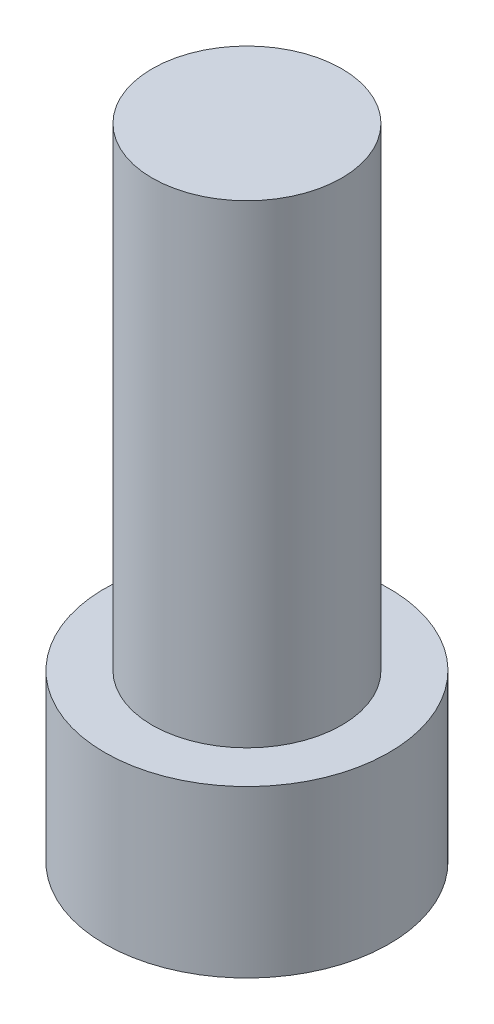
ISO-10303-21;
HEADER;
FILE_DESCRIPTION(('STEP AP214'),'2;1');
FILE_NAME('part.step','',(''),(''),'','','');
FILE_SCHEMA(('AUTOMOTIVE_DESIGN { 1 0 10303 214 1 1 1 1 }'));
ENDSEC;
DATA;
#1=APPLICATION_CONTEXT('core data for automotive mechanical design processes');
#2=APPLICATION_PROTOCOL_DEFINITION('international standard','automotive_design',2000,#1);
#3=PRODUCT_CONTEXT('',#1,'mechanical');
#4=PRODUCT('Part','Part','',(#3));
#5=PRODUCT_RELATED_PRODUCT_CATEGORY('part','',(#4));
#6=PRODUCT_DEFINITION_FORMATION('','',#4);
#7=PRODUCT_DEFINITION_CONTEXT('part definition',#1,'design');
#8=PRODUCT_DEFINITION('design','',#6,#7);
#9=PRODUCT_DEFINITION_SHAPE('','',#8);
#10=(LENGTH_UNIT() NAMED_UNIT(*) SI_UNIT(.MILLI.,.METRE.));
#11=(NAMED_UNIT(*) PLANE_ANGLE_UNIT() SI_UNIT($,.RADIAN.));
#12=(NAMED_UNIT(*) SI_UNIT($,.STERADIAN.) SOLID_ANGLE_UNIT());
#13=UNCERTAINTY_MEASURE_WITH_UNIT(LENGTH_MEASURE(1.E-05),#10,'distance_accuracy_value','');
#14=(GEOMETRIC_REPRESENTATION_CONTEXT(3) GLOBAL_UNCERTAINTY_ASSIGNED_CONTEXT((#13)) GLOBAL_UNIT_ASSIGNED_CONTEXT((#10,
#11,#12)) REPRESENTATION_CONTEXT('',''));
#15=CARTESIAN_POINT('',(0.,0.,0.));
#16=DIRECTION('',(0.,0.,1.));
#17=DIRECTION('',(1.,0.,0.));
#18=AXIS2_PLACEMENT_3D('',#15,#16,#17);
#19=CARTESIAN_POINT('',(0.,7.,0.));
#20=DIRECTION('',(0.,1.,0.));
#21=DIRECTION('',(0.,0.,1.));
#22=AXIS2_PLACEMENT_3D('',#19,#20,#21);
#23=PLANE('',#22);
#24=CARTESIAN_POINT('',(0.,7.,0.));
#25=DIRECTION('',(0.,1.,0.));
#26=DIRECTION('',(0.,0.,1.));
#27=AXIS2_PLACEMENT_3D('',#24,#25,#26);
#28=CIRCLE('',#27,6.);
#29=CARTESIAN_POINT('',(0.,7.,6.));
#30=VERTEX_POINT('',#29);
#31=EDGE_CURVE('E10',#30,#30,#28,.T.);
#32=ORIENTED_EDGE('',*,*,#31,.T.);
#33=EDGE_LOOP('',(#32));
#34=FACE_BOUND('',#33,.T.);
#35=CARTESIAN_POINT('',(0.,7.,0.));
#36=DIRECTION('',(0.,1.,0.));
#37=DIRECTION('',(0.,0.,1.));
#38=AXIS2_PLACEMENT_3D('',#35,#36,#37);
#39=CIRCLE('',#38,4.);
#40=CARTESIAN_POINT('',(0.,7.,4.));
#41=VERTEX_POINT('',#40);
#42=EDGE_CURVE('E43',#41,#41,#39,.T.);
#43=ORIENTED_EDGE('',*,*,#42,.F.);
#44=EDGE_LOOP('',(#43));
#45=FACE_BOUND('',#44,.T.);
#46=ADVANCED_FACE('F30',(#34,#45),#23,.T.);
#47=CARTESIAN_POINT('',(0.,7.,0.));
#48=DIRECTION('',(0.,-1.,0.));
#49=DIRECTION('',(0.,0.,-1.));
#50=AXIS2_PLACEMENT_3D('',#47,#48,#49);
#51=CYLINDRICAL_SURFACE('',#50,6.);
#52=ORIENTED_EDGE('',*,*,#31,.F.);
#53=EDGE_LOOP('',(#52));
#54=FACE_BOUND('',#53,.T.);
#55=CARTESIAN_POINT('',(0.,0.,0.));
#56=DIRECTION('',(0.,1.,0.));
#57=DIRECTION('',(0.,0.,1.));
#58=AXIS2_PLACEMENT_3D('',#55,#56,#57);
#59=CIRCLE('',#58,6.);
#60=CARTESIAN_POINT('',(0.,0.,6.));
#61=VERTEX_POINT('',#60);
#62=EDGE_CURVE('E34',#61,#61,#59,.T.);
#63=ORIENTED_EDGE('',*,*,#62,.T.);
#64=EDGE_LOOP('',(#63));
#65=FACE_BOUND('',#64,.T.);
#66=ADVANCED_FACE('F32',(#54,#65),#51,.T.);
#67=CARTESIAN_POINT('',(0.,0.,0.));
#68=DIRECTION('',(0.,1.,0.));
#69=DIRECTION('',(0.,0.,1.));
#70=AXIS2_PLACEMENT_3D('',#67,#68,#69);
#71=PLANE('',#70);
#72=ORIENTED_EDGE('',*,*,#62,.F.);
#73=EDGE_LOOP('',(#72));
#74=FACE_BOUND('',#73,.T.);
#75=ADVANCED_FACE('F54',(#74),#71,.F.);
#76=CARTESIAN_POINT('',(0.,27.,0.));
#77=DIRECTION('',(0.,-1.,0.));
#78=DIRECTION('',(0.,0.,-1.));
#79=AXIS2_PLACEMENT_3D('',#76,#77,#78);
#80=CYLINDRICAL_SURFACE('',#79,4.);
#81=CARTESIAN_POINT('',(0.,27.,0.));
#82=DIRECTION('',(0.,1.,0.));
#83=DIRECTION('',(0.,0.,1.));
#84=AXIS2_PLACEMENT_3D('',#81,#82,#83);
#85=CIRCLE('',#84,4.);
#86=CARTESIAN_POINT('',(0.,27.,4.));
#87=VERTEX_POINT('',#86);
#88=EDGE_CURVE('E41',#87,#87,#85,.T.);
#89=ORIENTED_EDGE('',*,*,#88,.F.);
#90=EDGE_LOOP('',(#89));
#91=FACE_BOUND('',#90,.T.);
#92=ORIENTED_EDGE('',*,*,#42,.T.);
#93=EDGE_LOOP('',(#92));
#94=FACE_BOUND('',#93,.T.);
#95=ADVANCED_FACE('F51',(#91,#94),#80,.T.);
#96=CARTESIAN_POINT('',(0.,27.,0.));
#97=DIRECTION('',(0.,1.,0.));
#98=DIRECTION('',(0.,0.,1.));
#99=AXIS2_PLACEMENT_3D('',#96,#97,#98);
#100=PLANE('',#99);
#101=ORIENTED_EDGE('',*,*,#88,.T.);
#102=EDGE_LOOP('',(#101));
#103=FACE_BOUND('',#102,.T.);
#104=ADVANCED_FACE('F49',(#103),#100,.T.);
#105=CLOSED_SHELL('',(#46,#66,#75,#95,#104));
#106=MANIFOLD_SOLID_BREP('B2',#105);
#107=ADVANCED_BREP_SHAPE_REPRESENTATION('',(#18,#106),#14);
#108=SHAPE_DEFINITION_REPRESENTATION(#9,#107);
ENDSEC;
END-ISO-10303-21;
